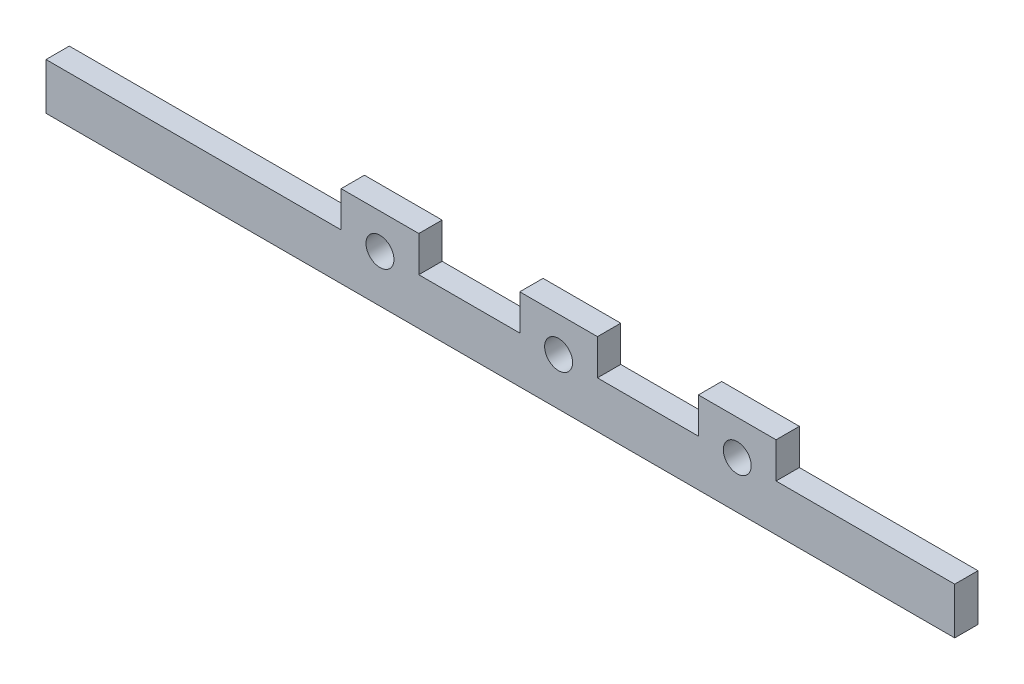
ISO-10303-21;
HEADER;
FILE_DESCRIPTION(('STEP AP214'),'2;1');
FILE_NAME('part.step','',(''),(''),'','','');
FILE_SCHEMA(('AUTOMOTIVE_DESIGN { 1 0 10303 214 1 1 1 1 }'));
ENDSEC;
DATA;
#1=APPLICATION_CONTEXT('core data for automotive mechanical design processes');
#2=APPLICATION_PROTOCOL_DEFINITION('international standard','automotive_design',2000,#1);
#3=PRODUCT_CONTEXT('',#1,'mechanical');
#4=PRODUCT('Part','Part','',(#3));
#5=PRODUCT_RELATED_PRODUCT_CATEGORY('part','',(#4));
#6=PRODUCT_DEFINITION_FORMATION('','',#4);
#7=PRODUCT_DEFINITION_CONTEXT('part definition',#1,'design');
#8=PRODUCT_DEFINITION('design','',#6,#7);
#9=PRODUCT_DEFINITION_SHAPE('','',#8);
#10=(LENGTH_UNIT() NAMED_UNIT(*) SI_UNIT(.MILLI.,.METRE.));
#11=(NAMED_UNIT(*) PLANE_ANGLE_UNIT() SI_UNIT($,.RADIAN.));
#12=(NAMED_UNIT(*) SI_UNIT($,.STERADIAN.) SOLID_ANGLE_UNIT());
#13=UNCERTAINTY_MEASURE_WITH_UNIT(LENGTH_MEASURE(1.E-05),#10,'distance_accuracy_value','');
#14=(GEOMETRIC_REPRESENTATION_CONTEXT(3) GLOBAL_UNCERTAINTY_ASSIGNED_CONTEXT((#13)) GLOBAL_UNIT_ASSIGNED_CONTEXT((#10,
#11,#12)) REPRESENTATION_CONTEXT('',''));
#15=CARTESIAN_POINT('',(0.,0.,0.));
#16=DIRECTION('',(0.,0.,1.));
#17=DIRECTION('',(1.,0.,0.));
#18=AXIS2_PLACEMENT_3D('',#15,#16,#17);
#19=CARTESIAN_POINT('',(0.,0.,15.));
#20=DIRECTION('',(0.,0.,-1.));
#21=DIRECTION('',(-1.,0.,0.));
#22=AXIS2_PLACEMENT_3D('',#19,#20,#21);
#23=PLANE('',#22);
#24=CARTESIAN_POINT('',(-77.5,30.5,15.));
#25=DIRECTION('',(0.,0.,1.));
#26=DIRECTION('',(1.,0.,0.));
#27=AXIS2_PLACEMENT_3D('',#24,#25,#26);
#28=CIRCLE('',#27,9.00000000000001);
#29=CARTESIAN_POINT('',(-68.4999999999999,30.5,15.));
#30=VERTEX_POINT('',#29);
#31=EDGE_CURVE('E339',#30,#30,#28,.T.);
#32=ORIENTED_EDGE('',*,*,#31,.F.);
#33=EDGE_LOOP('',(#32));
#34=FACE_BOUND('',#33,.T.);
#35=DIRECTION('',(0.,1.,0.));
#36=VECTOR('',#35,1.);
#37=CARTESIAN_POINT('',(62.5,30.,15.));
#38=LINE('',#37,#36);
#39=CARTESIAN_POINT('',(62.5,30.,15.));
#40=VERTEX_POINT('',#39);
#41=CARTESIAN_POINT('',(62.5,53.,15.));
#42=VERTEX_POINT('',#41);
#43=EDGE_CURVE('E209',#40,#42,#38,.T.);
#44=ORIENTED_EDGE('',*,*,#43,.T.);
#45=DIRECTION('',(-1.,0.,0.));
#46=VECTOR('',#45,1.);
#47=CARTESIAN_POINT('',(12.5,53.,15.));
#48=LINE('',#47,#46);
#49=CARTESIAN_POINT('',(12.5,53.,15.));
#50=VERTEX_POINT('',#49);
#51=EDGE_CURVE('E117',#42,#50,#48,.T.);
#52=ORIENTED_EDGE('',*,*,#51,.T.);
#53=DIRECTION('',(0.,-1.,0.));
#54=VECTOR('',#53,1.);
#55=CARTESIAN_POINT('',(12.5,30.,15.));
#56=LINE('',#55,#54);
#57=CARTESIAN_POINT('',(12.5,30.,15.));
#58=VERTEX_POINT('',#57);
#59=EDGE_CURVE('E248',#50,#58,#56,.T.);
#60=ORIENTED_EDGE('',*,*,#59,.T.);
#61=DIRECTION('',(-1.,0.,0.));
#62=VECTOR('',#61,1.);
#63=CARTESIAN_POINT('',(12.5,30.,15.));
#64=LINE('',#63,#62);
#65=CARTESIAN_POINT('',(-52.5,30.,15.));
#66=VERTEX_POINT('',#65);
#67=EDGE_CURVE('E267',#58,#66,#64,.T.);
#68=ORIENTED_EDGE('',*,*,#67,.T.);
#69=DIRECTION('',(0.,1.,0.));
#70=VECTOR('',#69,1.);
#71=CARTESIAN_POINT('',(-52.5,30.,15.));
#72=LINE('',#71,#70);
#73=CARTESIAN_POINT('',(-52.5,53.,15.));
#74=VERTEX_POINT('',#73);
#75=EDGE_CURVE('E264',#66,#74,#72,.T.);
#76=ORIENTED_EDGE('',*,*,#75,.T.);
#77=DIRECTION('',(-1.,0.,0.));
#78=VECTOR('',#77,1.);
#79=CARTESIAN_POINT('',(-102.5,53.,15.));
#80=LINE('',#79,#78);
#81=CARTESIAN_POINT('',(-102.5,53.,15.));
#82=VERTEX_POINT('',#81);
#83=EDGE_CURVE('E266',#74,#82,#80,.T.);
#84=ORIENTED_EDGE('',*,*,#83,.T.);
#85=DIRECTION('',(0.,-1.,0.));
#86=VECTOR('',#85,1.);
#87=CARTESIAN_POINT('',(-102.5,30.,15.));
#88=LINE('',#87,#86);
#89=CARTESIAN_POINT('',(-102.5,30.,15.));
#90=VERTEX_POINT('',#89);
#91=EDGE_CURVE('E269',#82,#90,#88,.T.);
#92=ORIENTED_EDGE('',*,*,#91,.T.);
#93=DIRECTION('',(-1.,0.,0.));
#94=VECTOR('',#93,1.);
#95=CARTESIAN_POINT('',(-102.5,30.,15.));
#96=LINE('',#95,#94);
#97=CARTESIAN_POINT('',(-292.5,30.,15.));
#98=VERTEX_POINT('',#97);
#99=EDGE_CURVE('E275',#90,#98,#96,.T.);
#100=ORIENTED_EDGE('',*,*,#99,.T.);
#101=DIRECTION('',(0.,-1.,0.));
#102=VECTOR('',#101,1.);
#103=CARTESIAN_POINT('',(-292.5,0.,15.));
#104=LINE('',#103,#102);
#105=CARTESIAN_POINT('',(-292.5,0.,15.));
#106=VERTEX_POINT('',#105);
#107=EDGE_CURVE('E277',#98,#106,#104,.T.);
#108=ORIENTED_EDGE('',*,*,#107,.T.);
#109=DIRECTION('',(1.,0.,0.));
#110=VECTOR('',#109,1.);
#111=CARTESIAN_POINT('',(-292.5,0.,15.));
#112=LINE('',#111,#110);
#113=CARTESIAN_POINT('',(292.5,0.,15.));
#114=VERTEX_POINT('',#113);
#115=EDGE_CURVE('E279',#106,#114,#112,.T.);
#116=ORIENTED_EDGE('',*,*,#115,.T.);
#117=DIRECTION('',(0.,1.,0.));
#118=VECTOR('',#117,1.);
#119=CARTESIAN_POINT('',(292.5,0.,15.));
#120=LINE('',#119,#118);
#121=CARTESIAN_POINT('',(292.5,30.,15.));
#122=VERTEX_POINT('',#121);
#123=EDGE_CURVE('E281',#114,#122,#120,.T.);
#124=ORIENTED_EDGE('',*,*,#123,.T.);
#125=DIRECTION('',(-1.,0.,0.));
#126=VECTOR('',#125,1.);
#127=CARTESIAN_POINT('',(177.5,30.0000000000001,15.));
#128=LINE('',#127,#126);
#129=CARTESIAN_POINT('',(177.5,30.0000000000001,15.));
#130=VERTEX_POINT('',#129);
#131=EDGE_CURVE('E283',#122,#130,#128,.T.);
#132=ORIENTED_EDGE('',*,*,#131,.T.);
#133=DIRECTION('',(0.,1.,0.));
#134=VECTOR('',#133,1.);
#135=CARTESIAN_POINT('',(177.5,30.0000000000001,15.));
#136=LINE('',#135,#134);
#137=CARTESIAN_POINT('',(177.5,53.,15.));
#138=VERTEX_POINT('',#137);
#139=EDGE_CURVE('E160',#130,#138,#136,.T.);
#140=ORIENTED_EDGE('',*,*,#139,.T.);
#141=DIRECTION('',(-1.,0.,0.));
#142=VECTOR('',#141,1.);
#143=CARTESIAN_POINT('',(127.5,53.,15.));
#144=LINE('',#143,#142);
#145=CARTESIAN_POINT('',(127.5,53.,15.));
#146=VERTEX_POINT('',#145);
#147=EDGE_CURVE('E154',#138,#146,#144,.T.);
#148=ORIENTED_EDGE('',*,*,#147,.T.);
#149=DIRECTION('',(0.,-1.,0.));
#150=VECTOR('',#149,1.);
#151=CARTESIAN_POINT('',(127.5,30.0000000000001,15.));
#152=LINE('',#151,#150);
#153=CARTESIAN_POINT('',(127.5,30.0000000000001,15.));
#154=VERTEX_POINT('',#153);
#155=EDGE_CURVE('E158',#146,#154,#152,.T.);
#156=ORIENTED_EDGE('',*,*,#155,.T.);
#157=DIRECTION('',(-1.,0.,0.));
#158=VECTOR('',#157,1.);
#159=CARTESIAN_POINT('',(62.5,30.,15.));
#160=LINE('',#159,#158);
#161=EDGE_CURVE('E50',#154,#40,#160,.T.);
#162=ORIENTED_EDGE('',*,*,#161,.T.);
#163=EDGE_LOOP('',(#44,#52,#60,#68,#76,#84,#92,#100,#108,#116,#124,#132,#140,#148,#156,#162));
#164=FACE_BOUND('',#163,.T.);
#165=CARTESIAN_POINT('',(37.5,30.5,15.));
#166=DIRECTION('',(0.,0.,1.));
#167=DIRECTION('',(1.,0.,0.));
#168=AXIS2_PLACEMENT_3D('',#165,#166,#167);
#169=CIRCLE('',#168,9.00000000000001);
#170=CARTESIAN_POINT('',(46.5,30.5,15.));
#171=VERTEX_POINT('',#170);
#172=EDGE_CURVE('E182',#171,#171,#169,.T.);
#173=ORIENTED_EDGE('',*,*,#172,.F.);
#174=EDGE_LOOP('',(#173));
#175=FACE_BOUND('',#174,.T.);
#176=CARTESIAN_POINT('',(152.5,30.5,15.));
#177=DIRECTION('',(0.,0.,1.));
#178=DIRECTION('',(1.,0.,0.));
#179=AXIS2_PLACEMENT_3D('',#176,#177,#178);
#180=CIRCLE('',#179,9.00000000000001);
#181=CARTESIAN_POINT('',(161.5,30.5,15.));
#182=VERTEX_POINT('',#181);
#183=EDGE_CURVE('E330',#182,#182,#180,.T.);
#184=ORIENTED_EDGE('',*,*,#183,.F.);
#185=EDGE_LOOP('',(#184));
#186=FACE_BOUND('',#185,.T.);
#187=ADVANCED_FACE('F33',(#34,#164,#175,#186),#23,.F.);
#188=CARTESIAN_POINT('',(0.,0.,0.));
#189=DIRECTION('',(0.,0.,-1.));
#190=DIRECTION('',(-1.,0.,0.));
#191=AXIS2_PLACEMENT_3D('',#188,#189,#190);
#192=PLANE('',#191);
#193=CARTESIAN_POINT('',(-77.5,30.5,0.));
#194=DIRECTION('',(0.,0.,1.));
#195=DIRECTION('',(1.,0.,0.));
#196=AXIS2_PLACEMENT_3D('',#193,#194,#195);
#197=CIRCLE('',#196,9.00000000000001);
#198=CARTESIAN_POINT('',(-68.4999999999999,30.5,0.));
#199=VERTEX_POINT('',#198);
#200=EDGE_CURVE('E336',#199,#199,#197,.T.);
#201=ORIENTED_EDGE('',*,*,#200,.T.);
#202=EDGE_LOOP('',(#201));
#203=FACE_BOUND('',#202,.T.);
#204=DIRECTION('',(0.,1.,0.));
#205=VECTOR('',#204,1.);
#206=CARTESIAN_POINT('',(62.5,30.,0.));
#207=LINE('',#206,#205);
#208=CARTESIAN_POINT('',(62.5,30.,0.));
#209=VERTEX_POINT('',#208);
#210=CARTESIAN_POINT('',(62.5,53.,0.));
#211=VERTEX_POINT('',#210);
#212=EDGE_CURVE('E178',#209,#211,#207,.T.);
#213=ORIENTED_EDGE('',*,*,#212,.F.);
#214=DIRECTION('',(-1.,0.,0.));
#215=VECTOR('',#214,1.);
#216=CARTESIAN_POINT('',(62.5,30.,0.));
#217=LINE('',#216,#215);
#218=CARTESIAN_POINT('',(127.5,30.0000000000001,0.));
#219=VERTEX_POINT('',#218);
#220=EDGE_CURVE('E109',#219,#209,#217,.T.);
#221=ORIENTED_EDGE('',*,*,#220,.F.);
#222=DIRECTION('',(0.,-1.,0.));
#223=VECTOR('',#222,1.);
#224=CARTESIAN_POINT('',(127.5,30.0000000000001,0.));
#225=LINE('',#224,#223);
#226=CARTESIAN_POINT('',(127.5,53.,0.));
#227=VERTEX_POINT('',#226);
#228=EDGE_CURVE('E103',#227,#219,#225,.T.);
#229=ORIENTED_EDGE('',*,*,#228,.F.);
#230=DIRECTION('',(-1.,0.,0.));
#231=VECTOR('',#230,1.);
#232=CARTESIAN_POINT('',(127.5,53.,0.));
#233=LINE('',#232,#231);
#234=CARTESIAN_POINT('',(177.5,53.,0.));
#235=VERTEX_POINT('',#234);
#236=EDGE_CURVE('E168',#235,#227,#233,.T.);
#237=ORIENTED_EDGE('',*,*,#236,.F.);
#238=DIRECTION('',(0.,1.,0.));
#239=VECTOR('',#238,1.);
#240=CARTESIAN_POINT('',(177.5,30.0000000000001,0.));
#241=LINE('',#240,#239);
#242=CARTESIAN_POINT('',(177.5,30.0000000000001,0.));
#243=VERTEX_POINT('',#242);
#244=EDGE_CURVE('E204',#243,#235,#241,.T.);
#245=ORIENTED_EDGE('',*,*,#244,.F.);
#246=DIRECTION('',(-1.,0.,0.));
#247=VECTOR('',#246,1.);
#248=CARTESIAN_POINT('',(177.5,30.0000000000001,0.));
#249=LINE('',#248,#247);
#250=CARTESIAN_POINT('',(292.5,30.,0.));
#251=VERTEX_POINT('',#250);
#252=EDGE_CURVE('E202',#251,#243,#249,.T.);
#253=ORIENTED_EDGE('',*,*,#252,.F.);
#254=DIRECTION('',(0.,1.,0.));
#255=VECTOR('',#254,1.);
#256=CARTESIAN_POINT('',(292.5,0.,0.));
#257=LINE('',#256,#255);
#258=CARTESIAN_POINT('',(292.5,0.,0.));
#259=VERTEX_POINT('',#258);
#260=EDGE_CURVE('E200',#259,#251,#257,.T.);
#261=ORIENTED_EDGE('',*,*,#260,.F.);
#262=DIRECTION('',(1.,0.,0.));
#263=VECTOR('',#262,1.);
#264=CARTESIAN_POINT('',(-292.5,0.,0.));
#265=LINE('',#264,#263);
#266=CARTESIAN_POINT('',(-292.5,0.,0.));
#267=VERTEX_POINT('',#266);
#268=EDGE_CURVE('E198',#267,#259,#265,.T.);
#269=ORIENTED_EDGE('',*,*,#268,.F.);
#270=DIRECTION('',(0.,-1.,0.));
#271=VECTOR('',#270,1.);
#272=CARTESIAN_POINT('',(-292.5,0.,0.));
#273=LINE('',#272,#271);
#274=CARTESIAN_POINT('',(-292.5,30.,0.));
#275=VERTEX_POINT('',#274);
#276=EDGE_CURVE('E196',#275,#267,#273,.T.);
#277=ORIENTED_EDGE('',*,*,#276,.F.);
#278=DIRECTION('',(-1.,0.,0.));
#279=VECTOR('',#278,1.);
#280=CARTESIAN_POINT('',(-102.5,30.,0.));
#281=LINE('',#280,#279);
#282=CARTESIAN_POINT('',(-102.5,30.,0.));
#283=VERTEX_POINT('',#282);
#284=EDGE_CURVE('E194',#283,#275,#281,.T.);
#285=ORIENTED_EDGE('',*,*,#284,.F.);
#286=DIRECTION('',(0.,-1.,0.));
#287=VECTOR('',#286,1.);
#288=CARTESIAN_POINT('',(-102.5,30.,0.));
#289=LINE('',#288,#287);
#290=CARTESIAN_POINT('',(-102.5,53.,0.));
#291=VERTEX_POINT('',#290);
#292=EDGE_CURVE('E192',#291,#283,#289,.T.);
#293=ORIENTED_EDGE('',*,*,#292,.F.);
#294=DIRECTION('',(-1.,0.,0.));
#295=VECTOR('',#294,1.);
#296=CARTESIAN_POINT('',(-102.5,53.,0.));
#297=LINE('',#296,#295);
#298=CARTESIAN_POINT('',(-52.5,53.,0.));
#299=VERTEX_POINT('',#298);
#300=EDGE_CURVE('E190',#299,#291,#297,.T.);
#301=ORIENTED_EDGE('',*,*,#300,.F.);
#302=DIRECTION('',(0.,1.,0.));
#303=VECTOR('',#302,1.);
#304=CARTESIAN_POINT('',(-52.5,30.,0.));
#305=LINE('',#304,#303);
#306=CARTESIAN_POINT('',(-52.5,30.,0.));
#307=VERTEX_POINT('',#306);
#308=EDGE_CURVE('E188',#307,#299,#305,.T.);
#309=ORIENTED_EDGE('',*,*,#308,.F.);
#310=DIRECTION('',(-1.,0.,0.));
#311=VECTOR('',#310,1.);
#312=CARTESIAN_POINT('',(12.5,30.,0.));
#313=LINE('',#312,#311);
#314=CARTESIAN_POINT('',(12.5,30.,0.));
#315=VERTEX_POINT('',#314);
#316=EDGE_CURVE('E186',#315,#307,#313,.T.);
#317=ORIENTED_EDGE('',*,*,#316,.F.);
#318=DIRECTION('',(0.,-1.,0.));
#319=VECTOR('',#318,1.);
#320=CARTESIAN_POINT('',(12.5,30.,0.));
#321=LINE('',#320,#319);
#322=CARTESIAN_POINT('',(12.5,53.,0.));
#323=VERTEX_POINT('',#322);
#324=EDGE_CURVE('E184',#323,#315,#321,.T.);
#325=ORIENTED_EDGE('',*,*,#324,.F.);
#326=DIRECTION('',(-1.,0.,0.));
#327=VECTOR('',#326,1.);
#328=CARTESIAN_POINT('',(12.5,53.,0.));
#329=LINE('',#328,#327);
#330=EDGE_CURVE('E181',#211,#323,#329,.T.);
#331=ORIENTED_EDGE('',*,*,#330,.F.);
#332=EDGE_LOOP('',(#213,#221,#229,#237,#245,#253,#261,#269,#277,#285,#293,#301,#309,#317,#325,#331));
#333=FACE_BOUND('',#332,.T.);
#334=CARTESIAN_POINT('',(37.5,30.5,0.));
#335=DIRECTION('',(0.,0.,1.));
#336=DIRECTION('',(1.,0.,0.));
#337=AXIS2_PLACEMENT_3D('',#334,#335,#336);
#338=CIRCLE('',#337,9.00000000000001);
#339=CARTESIAN_POINT('',(46.5,30.5,0.));
#340=VERTEX_POINT('',#339);
#341=EDGE_CURVE('E342',#340,#340,#338,.T.);
#342=ORIENTED_EDGE('',*,*,#341,.T.);
#343=EDGE_LOOP('',(#342));
#344=FACE_BOUND('',#343,.T.);
#345=CARTESIAN_POINT('',(152.5,30.5,0.));
#346=DIRECTION('',(0.,0.,1.));
#347=DIRECTION('',(1.,0.,0.));
#348=AXIS2_PLACEMENT_3D('',#345,#346,#347);
#349=CIRCLE('',#348,9.00000000000001);
#350=CARTESIAN_POINT('',(161.5,30.5,0.));
#351=VERTEX_POINT('',#350);
#352=EDGE_CURVE('E333',#351,#351,#349,.T.);
#353=ORIENTED_EDGE('',*,*,#352,.T.);
#354=EDGE_LOOP('',(#353));
#355=FACE_BOUND('',#354,.T.);
#356=ADVANCED_FACE('F252',(#203,#333,#344,#355),#192,.T.);
#357=CARTESIAN_POINT('',(62.5,30.,15.));
#358=DIRECTION('',(-1.,0.,0.));
#359=DIRECTION('',(0.,0.,1.));
#360=AXIS2_PLACEMENT_3D('',#357,#358,#359);
#361=PLANE('',#360);
#362=ORIENTED_EDGE('',*,*,#212,.T.);
#363=DIRECTION('',(0.,0.,-1.));
#364=VECTOR('',#363,1.);
#365=CARTESIAN_POINT('',(62.5,53.,15.));
#366=LINE('',#365,#364);
#367=EDGE_CURVE('E11',#42,#211,#366,.T.);
#368=ORIENTED_EDGE('',*,*,#367,.F.);
#369=ORIENTED_EDGE('',*,*,#43,.F.);
#370=DIRECTION('',(0.,0.,-1.));
#371=VECTOR('',#370,1.);
#372=CARTESIAN_POINT('',(62.5,30.,15.));
#373=LINE('',#372,#371);
#374=EDGE_CURVE('E174',#40,#209,#373,.T.);
#375=ORIENTED_EDGE('',*,*,#374,.T.);
#376=EDGE_LOOP('',(#362,#368,#369,#375));
#377=FACE_BOUND('',#376,.T.);
#378=ADVANCED_FACE('F35',(#377),#361,.F.);
#379=CARTESIAN_POINT('',(12.5,53.,15.));
#380=DIRECTION('',(0.,-1.,0.));
#381=DIRECTION('',(0.,0.,-1.));
#382=AXIS2_PLACEMENT_3D('',#379,#380,#381);
#383=PLANE('',#382);
#384=ORIENTED_EDGE('',*,*,#330,.T.);
#385=DIRECTION('',(0.,0.,-1.));
#386=VECTOR('',#385,1.);
#387=CARTESIAN_POINT('',(12.5,53.,15.));
#388=LINE('',#387,#386);
#389=EDGE_CURVE('E42',#50,#323,#388,.T.);
#390=ORIENTED_EDGE('',*,*,#389,.F.);
#391=ORIENTED_EDGE('',*,*,#51,.F.);
#392=ORIENTED_EDGE('',*,*,#367,.T.);
#393=EDGE_LOOP('',(#384,#390,#391,#392));
#394=FACE_BOUND('',#393,.T.);
#395=ADVANCED_FACE('F483',(#394),#383,.F.);
#396=CARTESIAN_POINT('',(12.5,30.,15.));
#397=DIRECTION('',(1.,0.,0.));
#398=DIRECTION('',(0.,0.,-1.));
#399=AXIS2_PLACEMENT_3D('',#396,#397,#398);
#400=PLANE('',#399);
#401=ORIENTED_EDGE('',*,*,#324,.T.);
#402=DIRECTION('',(0.,0.,-1.));
#403=VECTOR('',#402,1.);
#404=CARTESIAN_POINT('',(12.5,30.,15.));
#405=LINE('',#404,#403);
#406=EDGE_CURVE('E240',#58,#315,#405,.T.);
#407=ORIENTED_EDGE('',*,*,#406,.F.);
#408=ORIENTED_EDGE('',*,*,#59,.F.);
#409=ORIENTED_EDGE('',*,*,#389,.T.);
#410=EDGE_LOOP('',(#401,#407,#408,#409));
#411=FACE_BOUND('',#410,.T.);
#412=ADVANCED_FACE('F246',(#411),#400,.F.);
#413=CARTESIAN_POINT('',(12.5,30.,15.));
#414=DIRECTION('',(0.,-1.,0.));
#415=DIRECTION('',(1.,0.,0.));
#416=AXIS2_PLACEMENT_3D('',#413,#414,#415);
#417=PLANE('',#416);
#418=ORIENTED_EDGE('',*,*,#316,.T.);
#419=DIRECTION('',(0.,0.,-1.));
#420=VECTOR('',#419,1.);
#421=CARTESIAN_POINT('',(-52.5,30.,15.));
#422=LINE('',#421,#420);
#423=EDGE_CURVE('E237',#66,#307,#422,.T.);
#424=ORIENTED_EDGE('',*,*,#423,.F.);
#425=ORIENTED_EDGE('',*,*,#67,.F.);
#426=ORIENTED_EDGE('',*,*,#406,.T.);
#427=EDGE_LOOP('',(#418,#424,#425,#426));
#428=FACE_BOUND('',#427,.T.);
#429=ADVANCED_FACE('F258',(#428),#417,.F.);
#430=CARTESIAN_POINT('',(-52.5,30.,15.));
#431=DIRECTION('',(-1.,0.,0.));
#432=DIRECTION('',(0.,0.,1.));
#433=AXIS2_PLACEMENT_3D('',#430,#431,#432);
#434=PLANE('',#433);
#435=ORIENTED_EDGE('',*,*,#308,.T.);
#436=DIRECTION('',(0.,0.,-1.));
#437=VECTOR('',#436,1.);
#438=CARTESIAN_POINT('',(-52.5,53.,15.));
#439=LINE('',#438,#437);
#440=EDGE_CURVE('E234',#74,#299,#439,.T.);
#441=ORIENTED_EDGE('',*,*,#440,.F.);
#442=ORIENTED_EDGE('',*,*,#75,.F.);
#443=ORIENTED_EDGE('',*,*,#423,.T.);
#444=EDGE_LOOP('',(#435,#441,#442,#443));
#445=FACE_BOUND('',#444,.T.);
#446=ADVANCED_FACE('F262',(#445),#434,.F.);
#447=CARTESIAN_POINT('',(-102.5,53.,15.));
#448=DIRECTION('',(0.,-1.,0.));
#449=DIRECTION('',(1.,0.,0.));
#450=AXIS2_PLACEMENT_3D('',#447,#448,#449);
#451=PLANE('',#450);
#452=ORIENTED_EDGE('',*,*,#300,.T.);
#453=DIRECTION('',(0.,0.,-1.));
#454=VECTOR('',#453,1.);
#455=CARTESIAN_POINT('',(-102.5,53.,15.));
#456=LINE('',#455,#454);
#457=EDGE_CURVE('E231',#82,#291,#456,.T.);
#458=ORIENTED_EDGE('',*,*,#457,.F.);
#459=ORIENTED_EDGE('',*,*,#83,.F.);
#460=ORIENTED_EDGE('',*,*,#440,.T.);
#461=EDGE_LOOP('',(#452,#458,#459,#460));
#462=FACE_BOUND('',#461,.T.);
#463=ADVANCED_FACE('F448',(#462),#451,.F.);
#464=CARTESIAN_POINT('',(-102.5,30.,15.));
#465=DIRECTION('',(1.,0.,0.));
#466=DIRECTION('',(0.,0.,-1.));
#467=AXIS2_PLACEMENT_3D('',#464,#465,#466);
#468=PLANE('',#467);
#469=ORIENTED_EDGE('',*,*,#292,.T.);
#470=DIRECTION('',(0.,0.,-1.));
#471=VECTOR('',#470,1.);
#472=CARTESIAN_POINT('',(-102.5,30.,15.));
#473=LINE('',#472,#471);
#474=EDGE_CURVE('E228',#90,#283,#473,.T.);
#475=ORIENTED_EDGE('',*,*,#474,.F.);
#476=ORIENTED_EDGE('',*,*,#91,.F.);
#477=ORIENTED_EDGE('',*,*,#457,.T.);
#478=EDGE_LOOP('',(#469,#475,#476,#477));
#479=FACE_BOUND('',#478,.T.);
#480=ADVANCED_FACE('F438',(#479),#468,.F.);
#481=CARTESIAN_POINT('',(-102.5,30.,15.));
#482=DIRECTION('',(0.,-1.,0.));
#483=DIRECTION('',(1.,0.,0.));
#484=AXIS2_PLACEMENT_3D('',#481,#482,#483);
#485=PLANE('',#484);
#486=ORIENTED_EDGE('',*,*,#284,.T.);
#487=DIRECTION('',(0.,0.,-1.));
#488=VECTOR('',#487,1.);
#489=CARTESIAN_POINT('',(-292.5,30.,15.));
#490=LINE('',#489,#488);
#491=EDGE_CURVE('E225',#98,#275,#490,.T.);
#492=ORIENTED_EDGE('',*,*,#491,.F.);
#493=ORIENTED_EDGE('',*,*,#99,.F.);
#494=ORIENTED_EDGE('',*,*,#474,.T.);
#495=EDGE_LOOP('',(#486,#492,#493,#494));
#496=FACE_BOUND('',#495,.T.);
#497=ADVANCED_FACE('F428',(#496),#485,.F.);
#498=CARTESIAN_POINT('',(-292.5,0.,15.));
#499=DIRECTION('',(1.,0.,0.));
#500=DIRECTION('',(0.,0.,-1.));
#501=AXIS2_PLACEMENT_3D('',#498,#499,#500);
#502=PLANE('',#501);
#503=ORIENTED_EDGE('',*,*,#276,.T.);
#504=DIRECTION('',(0.,0.,-1.));
#505=VECTOR('',#504,1.);
#506=CARTESIAN_POINT('',(-292.5,0.,15.));
#507=LINE('',#506,#505);
#508=EDGE_CURVE('E222',#106,#267,#507,.T.);
#509=ORIENTED_EDGE('',*,*,#508,.F.);
#510=ORIENTED_EDGE('',*,*,#107,.F.);
#511=ORIENTED_EDGE('',*,*,#491,.T.);
#512=EDGE_LOOP('',(#503,#509,#510,#511));
#513=FACE_BOUND('',#512,.T.);
#514=ADVANCED_FACE('F418',(#513),#502,.F.);
#515=CARTESIAN_POINT('',(-292.5,0.,15.));
#516=DIRECTION('',(0.,1.,0.));
#517=DIRECTION('',(0.,0.,1.));
#518=AXIS2_PLACEMENT_3D('',#515,#516,#517);
#519=PLANE('',#518);
#520=ORIENTED_EDGE('',*,*,#268,.T.);
#521=DIRECTION('',(0.,0.,-1.));
#522=VECTOR('',#521,1.);
#523=CARTESIAN_POINT('',(292.5,0.,15.));
#524=LINE('',#523,#522);
#525=EDGE_CURVE('E219',#114,#259,#524,.T.);
#526=ORIENTED_EDGE('',*,*,#525,.F.);
#527=ORIENTED_EDGE('',*,*,#115,.F.);
#528=ORIENTED_EDGE('',*,*,#508,.T.);
#529=EDGE_LOOP('',(#520,#526,#527,#528));
#530=FACE_BOUND('',#529,.T.);
#531=ADVANCED_FACE('F408',(#530),#519,.F.);
#532=CARTESIAN_POINT('',(292.5,0.,15.));
#533=DIRECTION('',(-1.,0.,0.));
#534=DIRECTION('',(0.,0.,1.));
#535=AXIS2_PLACEMENT_3D('',#532,#533,#534);
#536=PLANE('',#535);
#537=ORIENTED_EDGE('',*,*,#260,.T.);
#538=DIRECTION('',(0.,0.,-1.));
#539=VECTOR('',#538,1.);
#540=CARTESIAN_POINT('',(292.5,30.,15.));
#541=LINE('',#540,#539);
#542=EDGE_CURVE('E216',#122,#251,#541,.T.);
#543=ORIENTED_EDGE('',*,*,#542,.F.);
#544=ORIENTED_EDGE('',*,*,#123,.F.);
#545=ORIENTED_EDGE('',*,*,#525,.T.);
#546=EDGE_LOOP('',(#537,#543,#544,#545));
#547=FACE_BOUND('',#546,.T.);
#548=ADVANCED_FACE('F399',(#547),#536,.F.);
#549=CARTESIAN_POINT('',(177.5,30.0000000000001,15.));
#550=DIRECTION('',(0.,-1.,0.));
#551=DIRECTION('',(1.,0.,0.));
#552=AXIS2_PLACEMENT_3D('',#549,#550,#551);
#553=PLANE('',#552);
#554=ORIENTED_EDGE('',*,*,#252,.T.);
#555=DIRECTION('',(0.,0.,-1.));
#556=VECTOR('',#555,1.);
#557=CARTESIAN_POINT('',(177.5,30.0000000000001,15.));
#558=LINE('',#557,#556);
#559=EDGE_CURVE('E213',#130,#243,#558,.T.);
#560=ORIENTED_EDGE('',*,*,#559,.F.);
#561=ORIENTED_EDGE('',*,*,#131,.F.);
#562=ORIENTED_EDGE('',*,*,#542,.T.);
#563=EDGE_LOOP('',(#554,#560,#561,#562));
#564=FACE_BOUND('',#563,.T.);
#565=ADVANCED_FACE('F289',(#564),#553,.F.);
#566=CARTESIAN_POINT('',(177.5,30.0000000000001,15.));
#567=DIRECTION('',(-1.,0.,0.));
#568=DIRECTION('',(0.,0.,1.));
#569=AXIS2_PLACEMENT_3D('',#566,#567,#568);
#570=PLANE('',#569);
#571=ORIENTED_EDGE('',*,*,#244,.T.);
#572=DIRECTION('',(0.,0.,-1.));
#573=VECTOR('',#572,1.);
#574=CARTESIAN_POINT('',(177.5,53.,15.));
#575=LINE('',#574,#573);
#576=EDGE_CURVE('E169',#138,#235,#575,.T.);
#577=ORIENTED_EDGE('',*,*,#576,.F.);
#578=ORIENTED_EDGE('',*,*,#139,.F.);
#579=ORIENTED_EDGE('',*,*,#559,.T.);
#580=EDGE_LOOP('',(#571,#577,#578,#579));
#581=FACE_BOUND('',#580,.T.);
#582=ADVANCED_FACE('F293',(#581),#570,.F.);
#583=CARTESIAN_POINT('',(127.5,53.,15.));
#584=DIRECTION('',(0.,-1.,0.));
#585=DIRECTION('',(1.,0.,0.));
#586=AXIS2_PLACEMENT_3D('',#583,#584,#585);
#587=PLANE('',#586);
#588=ORIENTED_EDGE('',*,*,#236,.T.);
#589=DIRECTION('',(0.,0.,-1.));
#590=VECTOR('',#589,1.);
#591=CARTESIAN_POINT('',(127.5,53.,15.));
#592=LINE('',#591,#590);
#593=EDGE_CURVE('E165',#146,#227,#592,.T.);
#594=ORIENTED_EDGE('',*,*,#593,.F.);
#595=ORIENTED_EDGE('',*,*,#147,.F.);
#596=ORIENTED_EDGE('',*,*,#576,.T.);
#597=EDGE_LOOP('',(#588,#594,#595,#596));
#598=FACE_BOUND('',#597,.T.);
#599=ADVANCED_FACE('F166',(#598),#587,.F.);
#600=CARTESIAN_POINT('',(127.5,30.0000000000001,15.));
#601=DIRECTION('',(1.,0.,0.));
#602=DIRECTION('',(0.,0.,-1.));
#603=AXIS2_PLACEMENT_3D('',#600,#601,#602);
#604=PLANE('',#603);
#605=ORIENTED_EDGE('',*,*,#228,.T.);
#606=DIRECTION('',(0.,0.,-1.));
#607=VECTOR('',#606,1.);
#608=CARTESIAN_POINT('',(127.5,30.0000000000001,15.));
#609=LINE('',#608,#607);
#610=EDGE_CURVE('E170',#154,#219,#609,.T.);
#611=ORIENTED_EDGE('',*,*,#610,.F.);
#612=ORIENTED_EDGE('',*,*,#155,.F.);
#613=ORIENTED_EDGE('',*,*,#593,.T.);
#614=EDGE_LOOP('',(#605,#611,#612,#613));
#615=FACE_BOUND('',#614,.T.);
#616=ADVANCED_FACE('F172',(#615),#604,.F.);
#617=CARTESIAN_POINT('',(62.5,30.,15.));
#618=DIRECTION('',(0.,-1.,0.));
#619=DIRECTION('',(1.,0.,0.));
#620=AXIS2_PLACEMENT_3D('',#617,#618,#619);
#621=PLANE('',#620);
#622=ORIENTED_EDGE('',*,*,#220,.T.);
#623=ORIENTED_EDGE('',*,*,#374,.F.);
#624=ORIENTED_EDGE('',*,*,#161,.F.);
#625=ORIENTED_EDGE('',*,*,#610,.T.);
#626=EDGE_LOOP('',(#622,#623,#624,#625));
#627=FACE_BOUND('',#626,.T.);
#628=ADVANCED_FACE('F297',(#627),#621,.F.);
#629=CARTESIAN_POINT('',(37.5,30.5,15.));
#630=DIRECTION('',(0.,0.,-1.));
#631=DIRECTION('',(-1.,0.,0.));
#632=AXIS2_PLACEMENT_3D('',#629,#630,#631);
#633=CYLINDRICAL_SURFACE('',#632,9.00000000000001);
#634=ORIENTED_EDGE('',*,*,#172,.T.);
#635=EDGE_LOOP('',(#634));
#636=FACE_BOUND('',#635,.T.);
#637=ORIENTED_EDGE('',*,*,#341,.F.);
#638=EDGE_LOOP('',(#637));
#639=FACE_BOUND('',#638,.T.);
#640=ADVANCED_FACE('F299',(#636,#639),#633,.F.);
#641=CARTESIAN_POINT('',(-77.5,30.5,15.));
#642=DIRECTION('',(0.,0.,-1.));
#643=DIRECTION('',(-1.,0.,0.));
#644=AXIS2_PLACEMENT_3D('',#641,#642,#643);
#645=CYLINDRICAL_SURFACE('',#644,9.00000000000001);
#646=ORIENTED_EDGE('',*,*,#31,.T.);
#647=EDGE_LOOP('',(#646));
#648=FACE_BOUND('',#647,.T.);
#649=ORIENTED_EDGE('',*,*,#200,.F.);
#650=EDGE_LOOP('',(#649));
#651=FACE_BOUND('',#650,.T.);
#652=ADVANCED_FACE('F305',(#648,#651),#645,.F.);
#653=CARTESIAN_POINT('',(152.5,30.5,15.));
#654=DIRECTION('',(0.,0.,-1.));
#655=DIRECTION('',(-1.,0.,0.));
#656=AXIS2_PLACEMENT_3D('',#653,#654,#655);
#657=CYLINDRICAL_SURFACE('',#656,9.00000000000001);
#658=ORIENTED_EDGE('',*,*,#183,.T.);
#659=EDGE_LOOP('',(#658));
#660=FACE_BOUND('',#659,.T.);
#661=ORIENTED_EDGE('',*,*,#352,.F.);
#662=EDGE_LOOP('',(#661));
#663=FACE_BOUND('',#662,.T.);
#664=ADVANCED_FACE('F321',(#660,#663),#657,.F.);
#665=CLOSED_SHELL('',(#187,#356,#378,#395,#412,#429,#446,#463,#480,#497,#514,#531,#548,#565,
#582,#599,#616,#628,#640,#652,#664));
#666=MANIFOLD_SOLID_BREP('B2',#665);
#667=ADVANCED_BREP_SHAPE_REPRESENTATION('',(#18,#666),#14);
#668=SHAPE_DEFINITION_REPRESENTATION(#9,#667);
ENDSEC;
END-ISO-10303-21;
